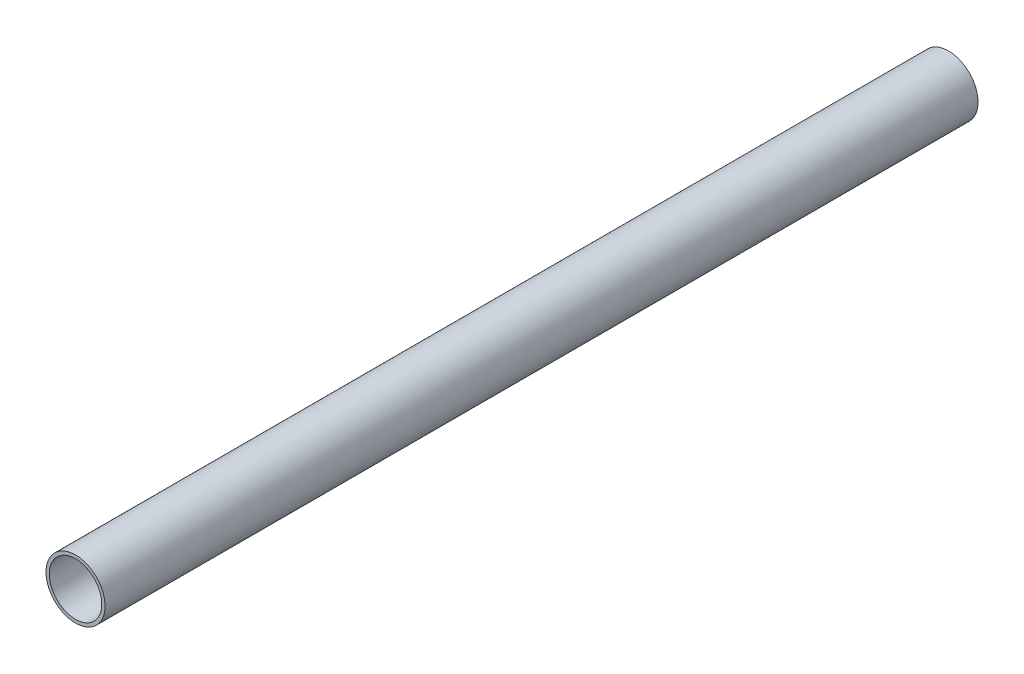
ISO-10303-21;
HEADER;
FILE_DESCRIPTION(('STEP AP214'),'2;1');
FILE_NAME('part.step','',(''),(''),'','','');
FILE_SCHEMA(('AUTOMOTIVE_DESIGN { 1 0 10303 214 1 1 1 1 }'));
ENDSEC;
DATA;
#1=APPLICATION_CONTEXT('core data for automotive mechanical design processes');
#2=APPLICATION_PROTOCOL_DEFINITION('international standard','automotive_design',2000,#1);
#3=PRODUCT_CONTEXT('',#1,'mechanical');
#4=PRODUCT('Part','Part','',(#3));
#5=PRODUCT_RELATED_PRODUCT_CATEGORY('part','',(#4));
#6=PRODUCT_DEFINITION_FORMATION('','',#4);
#7=PRODUCT_DEFINITION_CONTEXT('part definition',#1,'design');
#8=PRODUCT_DEFINITION('design','',#6,#7);
#9=PRODUCT_DEFINITION_SHAPE('','',#8);
#10=(LENGTH_UNIT() NAMED_UNIT(*) SI_UNIT(.MILLI.,.METRE.));
#11=(NAMED_UNIT(*) PLANE_ANGLE_UNIT() SI_UNIT($,.RADIAN.));
#12=(NAMED_UNIT(*) SI_UNIT($,.STERADIAN.) SOLID_ANGLE_UNIT());
#13=UNCERTAINTY_MEASURE_WITH_UNIT(LENGTH_MEASURE(1.E-05),#10,'distance_accuracy_value','');
#14=(GEOMETRIC_REPRESENTATION_CONTEXT(3) GLOBAL_UNCERTAINTY_ASSIGNED_CONTEXT((#13)) GLOBAL_UNIT_ASSIGNED_CONTEXT((#10,
#11,#12)) REPRESENTATION_CONTEXT('',''));
#15=CARTESIAN_POINT('',(0.,0.,0.));
#16=DIRECTION('',(0.,0.,1.));
#17=DIRECTION('',(1.,0.,0.));
#18=AXIS2_PLACEMENT_3D('',#15,#16,#17);
#19=CARTESIAN_POINT('',(0.,0.,265.98));
#20=DIRECTION('',(0.,0.,-1.));
#21=DIRECTION('',(-1.,0.,0.));
#22=AXIS2_PLACEMENT_3D('',#19,#20,#21);
#23=CYLINDRICAL_SURFACE('',#22,9.);
#24=CARTESIAN_POINT('',(0.,0.,265.98));
#25=DIRECTION('',(0.,0.,1.));
#26=DIRECTION('',(1.,0.,0.));
#27=AXIS2_PLACEMENT_3D('',#24,#25,#26);
#28=CIRCLE('',#27,9.);
#29=CARTESIAN_POINT('',(-9.,0.,265.98));
#30=VERTEX_POINT('',#29);
#31=EDGE_CURVE('E10',#30,#30,#28,.T.);
#32=CARTESIAN_POINT('',(0.,0.,0.));
#33=DIRECTION('',(0.,0.,1.));
#34=DIRECTION('',(1.,0.,0.));
#35=AXIS2_PLACEMENT_3D('',#32,#33,#34);
#36=CIRCLE('',#35,9.);
#37=CARTESIAN_POINT('',(-9.,0.,0.));
#38=VERTEX_POINT('',#37);
#39=EDGE_CURVE('E38',#38,#38,#36,.T.);
#40=CARTESIAN_POINT('',(-9.,0.,265.98));
#41=CARTESIAN_POINT('',(-9.,0.,263.209375));
#42=CARTESIAN_POINT('',(-9.,0.,260.43875));
#43=CARTESIAN_POINT('',(-9.,0.,254.8975));
#44=CARTESIAN_POINT('',(-9.,0.,252.126875));
#45=CARTESIAN_POINT('',(-9.,0.,246.585625));
#46=CARTESIAN_POINT('',(-9.,0.,243.815));
#47=CARTESIAN_POINT('',(-9.,0.,238.27375));
#48=CARTESIAN_POINT('',(-9.,0.,235.503125));
#49=CARTESIAN_POINT('',(-9.,0.,229.961875));
#50=CARTESIAN_POINT('',(-9.,0.,227.19125));
#51=CARTESIAN_POINT('',(-9.,0.,221.65));
#52=CARTESIAN_POINT('',(-9.,0.,218.879375));
#53=CARTESIAN_POINT('',(-9.,0.,213.338125));
#54=CARTESIAN_POINT('',(-9.,0.,210.5675));
#55=CARTESIAN_POINT('',(-9.,0.,205.02625));
#56=CARTESIAN_POINT('',(-9.,0.,202.255625));
#57=CARTESIAN_POINT('',(-9.,0.,196.714375));
#58=CARTESIAN_POINT('',(-9.,0.,193.94375));
#59=CARTESIAN_POINT('',(-9.,0.,188.4025));
#60=CARTESIAN_POINT('',(-9.,0.,185.631875));
#61=CARTESIAN_POINT('',(-9.,0.,180.090625));
#62=CARTESIAN_POINT('',(-9.,0.,177.32));
#63=CARTESIAN_POINT('',(-9.,0.,171.77875));
#64=CARTESIAN_POINT('',(-9.,0.,169.008125));
#65=CARTESIAN_POINT('',(-9.,0.,163.466875));
#66=CARTESIAN_POINT('',(-9.,0.,160.69625));
#67=CARTESIAN_POINT('',(-9.,0.,155.155));
#68=CARTESIAN_POINT('',(-9.,0.,152.384375));
#69=CARTESIAN_POINT('',(-9.,0.,146.843125));
#70=CARTESIAN_POINT('',(-9.,0.,144.0725));
#71=CARTESIAN_POINT('',(-9.,0.,138.53125));
#72=CARTESIAN_POINT('',(-9.,0.,135.760625));
#73=CARTESIAN_POINT('',(-9.,0.,130.219375));
#74=CARTESIAN_POINT('',(-9.,0.,127.44875));
#75=CARTESIAN_POINT('',(-9.,0.,121.9075));
#76=CARTESIAN_POINT('',(-9.,0.,119.136875));
#77=CARTESIAN_POINT('',(-9.,0.,113.595625));
#78=CARTESIAN_POINT('',(-9.,0.,110.825));
#79=CARTESIAN_POINT('',(-9.,0.,105.28375));
#80=CARTESIAN_POINT('',(-9.,0.,102.513125));
#81=CARTESIAN_POINT('',(-9.,0.,96.971875));
#82=CARTESIAN_POINT('',(-9.,0.,94.20125));
#83=CARTESIAN_POINT('',(-9.,0.,88.66));
#84=CARTESIAN_POINT('',(-9.,0.,85.889375));
#85=CARTESIAN_POINT('',(-9.,0.,80.348125));
#86=CARTESIAN_POINT('',(-9.,0.,77.5775));
#87=CARTESIAN_POINT('',(-9.,0.,72.03625));
#88=CARTESIAN_POINT('',(-9.,0.,69.265625));
#89=CARTESIAN_POINT('',(-9.,0.,63.724375));
#90=CARTESIAN_POINT('',(-9.,0.,60.9537499999999));
#91=CARTESIAN_POINT('',(-9.,0.,55.4124999999999));
#92=CARTESIAN_POINT('',(-9.,0.,52.6418749999999));
#93=CARTESIAN_POINT('',(-9.,0.,47.100625));
#94=CARTESIAN_POINT('',(-9.,0.,44.33));
#95=CARTESIAN_POINT('',(-9.,0.,38.78875));
#96=CARTESIAN_POINT('',(-9.,0.,36.018125));
#97=CARTESIAN_POINT('',(-9.,0.,30.476875));
#98=CARTESIAN_POINT('',(-9.,0.,27.70625));
#99=CARTESIAN_POINT('',(-9.,0.,22.165));
#100=CARTESIAN_POINT('',(-9.,0.,19.3943749999999));
#101=CARTESIAN_POINT('',(-9.,0.,13.8531249999999));
#102=CARTESIAN_POINT('',(-9.,0.,11.0825));
#103=CARTESIAN_POINT('',(-9.,0.,5.54124999999996));
#104=CARTESIAN_POINT('',(-9.,0.,2.77062499999996));
#105=CARTESIAN_POINT('',(-9.,0.,0.));
#106=B_SPLINE_CURVE_WITH_KNOTS('',3,(#40,#41,#42,#43,#44,#45,#46,#47,#48,#49,#50,#51,#52,#53,
#54,#55,#56,#57,#58,#59,#60,#61,#62,#63,#64,#65,#66,#67,#68,#69,#70,#71,#72,#73,#74,#75,#76,#77,
#78,#79,#80,#81,#82,#83,#84,#85,#86,#87,#88,#89,#90,#91,#92,#93,#94,#95,#96,#97,#98,#99,#100,
#101,#102,#103,#104,#105),.UNSPECIFIED.,.F.,.F.,(4,2,2,2,2,2,2,2,2,2,2,2,2,2,2,2,2,2,2,2,2,2,2,
2,2,2,2,2,2,2,2,2,4),(0.,8.31187499999997,16.62375,24.935625,33.2475,41.559375,49.87125,
58.183125,66.495,74.806875,83.11875,91.430625,99.7424999999999,108.054375,116.36625,124.678125,
132.99,141.301875,149.61375,157.925625,166.2375,174.549375,182.86125,191.173125,199.485,
207.796875,216.10875,224.420625,232.7325,241.044375,249.35625,257.668125,265.98),.UNSPECIFIED.);
#107=EDGE_CURVE('BSEAM35',#30,#38,#106,.T.);
#108=ORIENTED_EDGE('',*,*,#31,.F.);
#109=ORIENTED_EDGE('',*,*,#39,.T.);
#110=ORIENTED_EDGE('',*,*,#107,.T.);
#111=ORIENTED_EDGE('',*,*,#107,.F.);
#112=EDGE_LOOP('',(#108,#110,#109,#111));
#113=FACE_BOUND('',#112,.T.);
#114=ADVANCED_FACE('F35',(#113),#23,.T.);
#115=CARTESIAN_POINT('',(0.,0.,265.98));
#116=DIRECTION('',(0.,0.,1.));
#117=DIRECTION('',(1.,0.,0.));
#118=AXIS2_PLACEMENT_3D('',#115,#116,#117);
#119=PLANE('',#118);
#120=CARTESIAN_POINT('',(0.,0.,265.98));
#121=DIRECTION('',(0.,0.,1.));
#122=DIRECTION('',(1.,0.,0.));
#123=AXIS2_PLACEMENT_3D('',#120,#121,#122);
#124=CIRCLE('',#123,8.);
#125=CARTESIAN_POINT('',(-8.,0.,265.98));
#126=VERTEX_POINT('',#125);
#127=EDGE_CURVE('E45',#126,#126,#124,.T.);
#128=ORIENTED_EDGE('',*,*,#127,.F.);
#129=EDGE_LOOP('',(#128));
#130=FACE_BOUND('',#129,.T.);
#131=ORIENTED_EDGE('',*,*,#31,.T.);
#132=EDGE_LOOP('',(#131));
#133=FACE_BOUND('',#132,.T.);
#134=ADVANCED_FACE('F56',(#130,#133),#119,.T.);
#135=CARTESIAN_POINT('',(0.,0.,0.));
#136=DIRECTION('',(0.,0.,1.));
#137=DIRECTION('',(1.,0.,0.));
#138=AXIS2_PLACEMENT_3D('',#135,#136,#137);
#139=PLANE('',#138);
#140=CARTESIAN_POINT('',(0.,0.,0.));
#141=DIRECTION('',(0.,0.,1.));
#142=DIRECTION('',(1.,0.,0.));
#143=AXIS2_PLACEMENT_3D('',#140,#141,#142);
#144=CIRCLE('',#143,8.);
#145=CARTESIAN_POINT('',(-8.,0.,0.));
#146=VERTEX_POINT('',#145);
#147=EDGE_CURVE('E47',#146,#146,#144,.T.);
#148=ORIENTED_EDGE('',*,*,#147,.T.);
#149=EDGE_LOOP('',(#148));
#150=FACE_BOUND('',#149,.T.);
#151=ORIENTED_EDGE('',*,*,#39,.F.);
#152=EDGE_LOOP('',(#151));
#153=FACE_BOUND('',#152,.T.);
#154=ADVANCED_FACE('F58',(#150,#153),#139,.F.);
#155=CARTESIAN_POINT('',(0.,0.,265.98));
#156=DIRECTION('',(0.,0.,-1.));
#157=DIRECTION('',(-1.,0.,0.));
#158=AXIS2_PLACEMENT_3D('',#155,#156,#157);
#159=CYLINDRICAL_SURFACE('',#158,8.);
#160=CARTESIAN_POINT('',(-8.,0.,265.98));
#161=CARTESIAN_POINT('',(-8.,0.,263.209375));
#162=CARTESIAN_POINT('',(-8.,0.,260.43875));
#163=CARTESIAN_POINT('',(-8.,0.,254.8975));
#164=CARTESIAN_POINT('',(-8.,0.,252.126875));
#165=CARTESIAN_POINT('',(-8.,0.,246.585625));
#166=CARTESIAN_POINT('',(-8.,0.,243.815));
#167=CARTESIAN_POINT('',(-8.,0.,238.27375));
#168=CARTESIAN_POINT('',(-8.,0.,235.503125));
#169=CARTESIAN_POINT('',(-8.,0.,229.961875));
#170=CARTESIAN_POINT('',(-8.,0.,227.19125));
#171=CARTESIAN_POINT('',(-8.,0.,221.65));
#172=CARTESIAN_POINT('',(-8.,0.,218.879375));
#173=CARTESIAN_POINT('',(-8.,0.,213.338125));
#174=CARTESIAN_POINT('',(-8.,0.,210.5675));
#175=CARTESIAN_POINT('',(-8.,0.,205.02625));
#176=CARTESIAN_POINT('',(-8.,0.,202.255625));
#177=CARTESIAN_POINT('',(-8.,0.,196.714375));
#178=CARTESIAN_POINT('',(-8.,0.,193.94375));
#179=CARTESIAN_POINT('',(-8.,0.,188.4025));
#180=CARTESIAN_POINT('',(-8.,0.,185.631875));
#181=CARTESIAN_POINT('',(-8.,0.,180.090625));
#182=CARTESIAN_POINT('',(-8.,0.,177.32));
#183=CARTESIAN_POINT('',(-8.,0.,171.77875));
#184=CARTESIAN_POINT('',(-8.,0.,169.008125));
#185=CARTESIAN_POINT('',(-8.,0.,163.466875));
#186=CARTESIAN_POINT('',(-8.,0.,160.69625));
#187=CARTESIAN_POINT('',(-8.,0.,155.155));
#188=CARTESIAN_POINT('',(-8.,0.,152.384375));
#189=CARTESIAN_POINT('',(-8.,0.,146.843125));
#190=CARTESIAN_POINT('',(-8.,0.,144.0725));
#191=CARTESIAN_POINT('',(-8.,0.,138.53125));
#192=CARTESIAN_POINT('',(-8.,0.,135.760625));
#193=CARTESIAN_POINT('',(-8.,0.,130.219375));
#194=CARTESIAN_POINT('',(-8.,0.,127.44875));
#195=CARTESIAN_POINT('',(-8.,0.,121.9075));
#196=CARTESIAN_POINT('',(-8.,0.,119.136875));
#197=CARTESIAN_POINT('',(-8.,0.,113.595625));
#198=CARTESIAN_POINT('',(-8.,0.,110.825));
#199=CARTESIAN_POINT('',(-8.,0.,105.28375));
#200=CARTESIAN_POINT('',(-8.,0.,102.513125));
#201=CARTESIAN_POINT('',(-8.,0.,96.9718749999999));
#202=CARTESIAN_POINT('',(-8.,0.,94.2012499999999));
#203=CARTESIAN_POINT('',(-8.,0.,88.6599999999999));
#204=CARTESIAN_POINT('',(-8.,0.,85.8893749999999));
#205=CARTESIAN_POINT('',(-8.,0.,80.3481249999999));
#206=CARTESIAN_POINT('',(-8.,0.,77.5774999999999));
#207=CARTESIAN_POINT('',(-8.,0.,72.0362499999999));
#208=CARTESIAN_POINT('',(-8.,0.,69.2656249999999));
#209=CARTESIAN_POINT('',(-8.,0.,63.7243749999999));
#210=CARTESIAN_POINT('',(-8.,0.,60.9537499999999));
#211=CARTESIAN_POINT('',(-8.,0.,55.4124999999999));
#212=CARTESIAN_POINT('',(-8.,0.,52.6418749999999));
#213=CARTESIAN_POINT('',(-8.,0.,47.1006249999999));
#214=CARTESIAN_POINT('',(-8.,0.,44.3299999999999));
#215=CARTESIAN_POINT('',(-8.,0.,38.7887499999999));
#216=CARTESIAN_POINT('',(-8.,0.,36.0181249999999));
#217=CARTESIAN_POINT('',(-8.,0.,30.4768749999999));
#218=CARTESIAN_POINT('',(-8.,0.,27.7062499999999));
#219=CARTESIAN_POINT('',(-8.,0.,22.1649999999999));
#220=CARTESIAN_POINT('',(-8.,0.,19.3943749999999));
#221=CARTESIAN_POINT('',(-8.,0.,13.8531249999999));
#222=CARTESIAN_POINT('',(-8.,0.,11.0824999999999));
#223=CARTESIAN_POINT('',(-8.,0.,5.54124999999996));
#224=CARTESIAN_POINT('',(-8.,0.,2.77062499999995));
#225=CARTESIAN_POINT('',(-8.,0.,0.));
#226=B_SPLINE_CURVE_WITH_KNOTS('',3,(#160,#161,#162,#163,#164,#165,#166,#167,#168,#169,#170,
#171,#172,#173,#174,#175,#176,#177,#178,#179,#180,#181,#182,#183,#184,#185,#186,#187,#188,#189,
#190,#191,#192,#193,#194,#195,#196,#197,#198,#199,#200,#201,#202,#203,#204,#205,#206,#207,#208,
#209,#210,#211,#212,#213,#214,#215,#216,#217,#218,#219,#220,#221,#222,#223,#224,#225),
.UNSPECIFIED.,.F.,.F.,(4,2,2,2,2,2,2,2,2,2,2,2,2,2,2,2,2,2,2,2,2,2,2,2,2,2,2,2,2,2,2,2,4),(0.,
8.31187500000002,16.62375,24.935625,33.2475,41.559375,49.87125,58.1831250000001,66.495,
74.806875,83.11875,91.430625,99.7425000000001,108.054375,116.36625,124.678125,132.99,141.301875,
149.61375,157.925625,166.2375,174.549375,182.86125,191.173125,199.485,207.796875,216.10875,
224.420625,232.7325,241.044375,249.35625,257.668125,265.98),.UNSPECIFIED.);
#227=EDGE_CURVE('BSEAM53',#126,#146,#226,.T.);
#228=ORIENTED_EDGE('',*,*,#127,.T.);
#229=ORIENTED_EDGE('',*,*,#147,.F.);
#230=ORIENTED_EDGE('',*,*,#227,.T.);
#231=ORIENTED_EDGE('',*,*,#227,.F.);
#232=EDGE_LOOP('',(#228,#230,#229,#231));
#233=FACE_BOUND('',#232,.T.);
#234=ADVANCED_FACE('F53',(#233),#159,.F.);
#235=CLOSED_SHELL('',(#114,#134,#154,#234));
#236=MANIFOLD_SOLID_BREP('B2',#235);
#237=ADVANCED_BREP_SHAPE_REPRESENTATION('',(#18,#236),#14);
#238=SHAPE_DEFINITION_REPRESENTATION(#9,#237);
ENDSEC;
END-ISO-10303-21;
